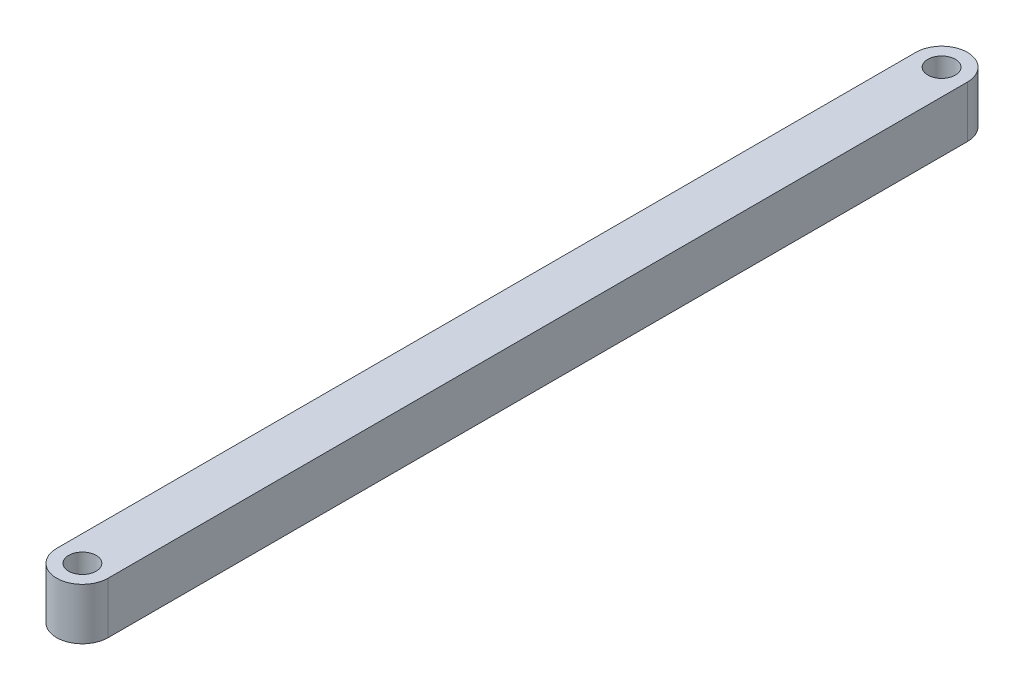
ISO-10303-21;
HEADER;
FILE_DESCRIPTION(('STEP AP214'),'2;1');
FILE_NAME('part.step','',(''),(''),'','','');
FILE_SCHEMA(('AUTOMOTIVE_DESIGN { 1 0 10303 214 1 1 1 1 }'));
ENDSEC;
DATA;
#1=APPLICATION_CONTEXT('core data for automotive mechanical design processes');
#2=APPLICATION_PROTOCOL_DEFINITION('international standard','automotive_design',2000,#1);
#3=PRODUCT_CONTEXT('',#1,'mechanical');
#4=PRODUCT('Part','Part','',(#3));
#5=PRODUCT_RELATED_PRODUCT_CATEGORY('part','',(#4));
#6=PRODUCT_DEFINITION_FORMATION('','',#4);
#7=PRODUCT_DEFINITION_CONTEXT('part definition',#1,'design');
#8=PRODUCT_DEFINITION('design','',#6,#7);
#9=PRODUCT_DEFINITION_SHAPE('','',#8);
#10=(LENGTH_UNIT() NAMED_UNIT(*) SI_UNIT(.MILLI.,.METRE.));
#11=(NAMED_UNIT(*) PLANE_ANGLE_UNIT() SI_UNIT($,.RADIAN.));
#12=(NAMED_UNIT(*) SI_UNIT($,.STERADIAN.) SOLID_ANGLE_UNIT());
#13=UNCERTAINTY_MEASURE_WITH_UNIT(LENGTH_MEASURE(1.E-05),#10,'distance_accuracy_value','');
#14=(GEOMETRIC_REPRESENTATION_CONTEXT(3) GLOBAL_UNCERTAINTY_ASSIGNED_CONTEXT((#13)) GLOBAL_UNIT_ASSIGNED_CONTEXT((#10,
#11,#12)) REPRESENTATION_CONTEXT('',''));
#15=CARTESIAN_POINT('',(0.,0.,0.));
#16=DIRECTION('',(0.,0.,1.));
#17=DIRECTION('',(1.,0.,0.));
#18=AXIS2_PLACEMENT_3D('',#15,#16,#17);
#19=CARTESIAN_POINT('',(0.,6.,50.));
#20=DIRECTION('',(0.,1.,0.));
#21=DIRECTION('',(0.,0.,1.));
#22=AXIS2_PLACEMENT_3D('',#19,#20,#21);
#23=PLANE('',#22);
#24=CARTESIAN_POINT('',(0.,6.,-50.));
#25=DIRECTION('',(0.,1.,0.));
#26=DIRECTION('',(0.,0.,1.));
#27=AXIS2_PLACEMENT_3D('',#24,#25,#26);
#28=CIRCLE('',#27,1.6);
#29=CARTESIAN_POINT('',(0.,6.,-48.4));
#30=VERTEX_POINT('',#29);
#31=EDGE_CURVE('E104',#30,#30,#28,.T.);
#32=ORIENTED_EDGE('',*,*,#31,.F.);
#33=EDGE_LOOP('',(#32));
#34=FACE_BOUND('',#33,.T.);
#35=CARTESIAN_POINT('',(0.,6.,50.));
#36=DIRECTION('',(0.,1.,0.));
#37=DIRECTION('',(0.,0.,1.));
#38=AXIS2_PLACEMENT_3D('',#35,#36,#37);
#39=CIRCLE('',#38,3.);
#40=CARTESIAN_POINT('',(-3.,6.,50.));
#41=VERTEX_POINT('',#40);
#42=CARTESIAN_POINT('',(3.,6.,50.));
#43=VERTEX_POINT('',#42);
#44=EDGE_CURVE('E89',#41,#43,#39,.T.);
#45=ORIENTED_EDGE('',*,*,#44,.T.);
#46=DIRECTION('',(0.,0.,-1.));
#47=VECTOR('',#46,1.);
#48=CARTESIAN_POINT('',(3.,6.,50.));
#49=LINE('',#48,#47);
#50=CARTESIAN_POINT('',(2.99999999999998,6.,-50.));
#51=VERTEX_POINT('',#50);
#52=EDGE_CURVE('E84',#43,#51,#49,.T.);
#53=ORIENTED_EDGE('',*,*,#52,.T.);
#54=CARTESIAN_POINT('',(0.,6.,-50.));
#55=DIRECTION('',(0.,1.,0.));
#56=DIRECTION('',(0.,0.,1.));
#57=AXIS2_PLACEMENT_3D('',#54,#55,#56);
#58=CIRCLE('',#57,3.);
#59=CARTESIAN_POINT('',(-3.00000000000002,6.,-50.));
#60=VERTEX_POINT('',#59);
#61=EDGE_CURVE('E87',#51,#60,#58,.T.);
#62=ORIENTED_EDGE('',*,*,#61,.T.);
#63=DIRECTION('',(0.,0.,1.));
#64=VECTOR('',#63,1.);
#65=CARTESIAN_POINT('',(-3.,6.,50.));
#66=LINE('',#65,#64);
#67=EDGE_CURVE('E54',#60,#41,#66,.T.);
#68=ORIENTED_EDGE('',*,*,#67,.T.);
#69=EDGE_LOOP('',(#45,#53,#62,#68));
#70=FACE_BOUND('',#69,.T.);
#71=CARTESIAN_POINT('',(0.,6.,50.));
#72=DIRECTION('',(0.,1.,0.));
#73=DIRECTION('',(0.,0.,1.));
#74=AXIS2_PLACEMENT_3D('',#71,#72,#73);
#75=CIRCLE('',#74,1.6);
#76=CARTESIAN_POINT('',(0.,6.,51.6));
#77=VERTEX_POINT('',#76);
#78=EDGE_CURVE('E119',#77,#77,#75,.T.);
#79=ORIENTED_EDGE('',*,*,#78,.F.);
#80=EDGE_LOOP('',(#79));
#81=FACE_BOUND('',#80,.T.);
#82=ADVANCED_FACE('F37',(#34,#70,#81),#23,.T.);
#83=CARTESIAN_POINT('',(0.,0.,50.));
#84=DIRECTION('',(0.,1.,0.));
#85=DIRECTION('',(0.,0.,1.));
#86=AXIS2_PLACEMENT_3D('',#83,#84,#85);
#87=PLANE('',#86);
#88=CARTESIAN_POINT('',(0.,0.,50.));
#89=DIRECTION('',(0.,1.,0.));
#90=DIRECTION('',(0.,0.,1.));
#91=AXIS2_PLACEMENT_3D('',#88,#89,#90);
#92=CIRCLE('',#91,3.);
#93=CARTESIAN_POINT('',(-3.,0.,50.));
#94=VERTEX_POINT('',#93);
#95=CARTESIAN_POINT('',(3.,0.,50.));
#96=VERTEX_POINT('',#95);
#97=EDGE_CURVE('E101',#94,#96,#92,.T.);
#98=ORIENTED_EDGE('',*,*,#97,.F.);
#99=DIRECTION('',(0.,0.,1.));
#100=VECTOR('',#99,1.);
#101=CARTESIAN_POINT('',(-3.,0.,50.));
#102=LINE('',#101,#100);
#103=CARTESIAN_POINT('',(-3.00000000000002,0.,-50.));
#104=VERTEX_POINT('',#103);
#105=EDGE_CURVE('E77',#104,#94,#102,.T.);
#106=ORIENTED_EDGE('',*,*,#105,.F.);
#107=CARTESIAN_POINT('',(0.,0.,-50.));
#108=DIRECTION('',(0.,1.,0.));
#109=DIRECTION('',(0.,0.,1.));
#110=AXIS2_PLACEMENT_3D('',#107,#108,#109);
#111=CIRCLE('',#110,3.);
#112=CARTESIAN_POINT('',(2.99999999999998,0.,-50.));
#113=VERTEX_POINT('',#112);
#114=EDGE_CURVE('E71',#113,#104,#111,.T.);
#115=ORIENTED_EDGE('',*,*,#114,.F.);
#116=DIRECTION('',(0.,0.,-1.));
#117=VECTOR('',#116,1.);
#118=CARTESIAN_POINT('',(3.,0.,50.));
#119=LINE('',#118,#117);
#120=EDGE_CURVE('E93',#96,#113,#119,.T.);
#121=ORIENTED_EDGE('',*,*,#120,.F.);
#122=EDGE_LOOP('',(#98,#106,#115,#121));
#123=FACE_BOUND('',#122,.T.);
#124=CARTESIAN_POINT('',(0.,0.,-50.));
#125=DIRECTION('',(0.,1.,0.));
#126=DIRECTION('',(0.,0.,1.));
#127=AXIS2_PLACEMENT_3D('',#124,#125,#126);
#128=CIRCLE('',#127,1.6);
#129=CARTESIAN_POINT('',(0.,0.,-48.4));
#130=VERTEX_POINT('',#129);
#131=EDGE_CURVE('E116',#130,#130,#128,.T.);
#132=ORIENTED_EDGE('',*,*,#131,.T.);
#133=EDGE_LOOP('',(#132));
#134=FACE_BOUND('',#133,.T.);
#135=CARTESIAN_POINT('',(0.,0.,50.));
#136=DIRECTION('',(0.,1.,0.));
#137=DIRECTION('',(0.,0.,1.));
#138=AXIS2_PLACEMENT_3D('',#135,#136,#137);
#139=CIRCLE('',#138,1.6);
#140=CARTESIAN_POINT('',(0.,0.,51.6));
#141=VERTEX_POINT('',#140);
#142=EDGE_CURVE('E122',#141,#141,#139,.T.);
#143=ORIENTED_EDGE('',*,*,#142,.T.);
#144=EDGE_LOOP('',(#143));
#145=FACE_BOUND('',#144,.T.);
#146=ADVANCED_FACE('F112',(#123,#134,#145),#87,.F.);
#147=CARTESIAN_POINT('',(0.,6.,50.));
#148=DIRECTION('',(0.,-1.,0.));
#149=DIRECTION('',(0.,0.,-1.));
#150=AXIS2_PLACEMENT_3D('',#147,#148,#149);
#151=CYLINDRICAL_SURFACE('',#150,3.);
#152=ORIENTED_EDGE('',*,*,#97,.T.);
#153=DIRECTION('',(0.,-1.,0.));
#154=VECTOR('',#153,1.);
#155=CARTESIAN_POINT('',(3.,6.,50.));
#156=LINE('',#155,#154);
#157=EDGE_CURVE('E11',#43,#96,#156,.T.);
#158=ORIENTED_EDGE('',*,*,#157,.F.);
#159=ORIENTED_EDGE('',*,*,#44,.F.);
#160=DIRECTION('',(0.,-1.,0.));
#161=VECTOR('',#160,1.);
#162=CARTESIAN_POINT('',(-3.,6.,50.));
#163=LINE('',#162,#161);
#164=EDGE_CURVE('E97',#41,#94,#163,.T.);
#165=ORIENTED_EDGE('',*,*,#164,.T.);
#166=EDGE_LOOP('',(#152,#158,#159,#165));
#167=FACE_BOUND('',#166,.T.);
#168=ADVANCED_FACE('F39',(#167),#151,.T.);
#169=CARTESIAN_POINT('',(3.,6.,50.));
#170=DIRECTION('',(-1.,0.,0.));
#171=DIRECTION('',(0.,0.,1.));
#172=AXIS2_PLACEMENT_3D('',#169,#170,#171);
#173=PLANE('',#172);
#174=ORIENTED_EDGE('',*,*,#120,.T.);
#175=DIRECTION('',(0.,-1.,0.));
#176=VECTOR('',#175,1.);
#177=CARTESIAN_POINT('',(2.99999999999998,6.,-50.));
#178=LINE('',#177,#176);
#179=EDGE_CURVE('E46',#51,#113,#178,.T.);
#180=ORIENTED_EDGE('',*,*,#179,.F.);
#181=ORIENTED_EDGE('',*,*,#52,.F.);
#182=ORIENTED_EDGE('',*,*,#157,.T.);
#183=EDGE_LOOP('',(#174,#180,#181,#182));
#184=FACE_BOUND('',#183,.T.);
#185=ADVANCED_FACE('F92',(#184),#173,.F.);
#186=CARTESIAN_POINT('',(0.,6.,-50.));
#187=DIRECTION('',(0.,-1.,0.));
#188=DIRECTION('',(0.,0.,-1.));
#189=AXIS2_PLACEMENT_3D('',#186,#187,#188);
#190=CYLINDRICAL_SURFACE('',#189,3.);
#191=ORIENTED_EDGE('',*,*,#114,.T.);
#192=DIRECTION('',(0.,-1.,0.));
#193=VECTOR('',#192,1.);
#194=CARTESIAN_POINT('',(-3.00000000000002,6.,-50.));
#195=LINE('',#194,#193);
#196=EDGE_CURVE('E94',#60,#104,#195,.T.);
#197=ORIENTED_EDGE('',*,*,#196,.F.);
#198=ORIENTED_EDGE('',*,*,#61,.F.);
#199=ORIENTED_EDGE('',*,*,#179,.T.);
#200=EDGE_LOOP('',(#191,#197,#198,#199));
#201=FACE_BOUND('',#200,.T.);
#202=ADVANCED_FACE('F95',(#201),#190,.T.);
#203=CARTESIAN_POINT('',(-3.,6.,50.));
#204=DIRECTION('',(1.,0.,0.));
#205=DIRECTION('',(0.,0.,-1.));
#206=AXIS2_PLACEMENT_3D('',#203,#204,#205);
#207=PLANE('',#206);
#208=ORIENTED_EDGE('',*,*,#105,.T.);
#209=ORIENTED_EDGE('',*,*,#164,.F.);
#210=ORIENTED_EDGE('',*,*,#67,.F.);
#211=ORIENTED_EDGE('',*,*,#196,.T.);
#212=EDGE_LOOP('',(#208,#209,#210,#211));
#213=FACE_BOUND('',#212,.T.);
#214=ADVANCED_FACE('F109',(#213),#207,.F.);
#215=CARTESIAN_POINT('',(0.,6.,-50.));
#216=DIRECTION('',(0.,-1.,0.));
#217=DIRECTION('',(0.,0.,-1.));
#218=AXIS2_PLACEMENT_3D('',#215,#216,#217);
#219=CYLINDRICAL_SURFACE('',#218,1.6);
#220=ORIENTED_EDGE('',*,*,#31,.T.);
#221=EDGE_LOOP('',(#220));
#222=FACE_BOUND('',#221,.T.);
#223=ORIENTED_EDGE('',*,*,#131,.F.);
#224=EDGE_LOOP('',(#223));
#225=FACE_BOUND('',#224,.T.);
#226=ADVANCED_FACE('F139',(#222,#225),#219,.F.);
#227=CARTESIAN_POINT('',(0.,6.,50.));
#228=DIRECTION('',(0.,-1.,0.));
#229=DIRECTION('',(0.,0.,-1.));
#230=AXIS2_PLACEMENT_3D('',#227,#228,#229);
#231=CYLINDRICAL_SURFACE('',#230,1.6);
#232=ORIENTED_EDGE('',*,*,#78,.T.);
#233=EDGE_LOOP('',(#232));
#234=FACE_BOUND('',#233,.T.);
#235=ORIENTED_EDGE('',*,*,#142,.F.);
#236=EDGE_LOOP('',(#235));
#237=FACE_BOUND('',#236,.T.);
#238=ADVANCED_FACE('F128',(#234,#237),#231,.F.);
#239=CLOSED_SHELL('',(#82,#146,#168,#185,#202,#214,#226,#238));
#240=MANIFOLD_SOLID_BREP('B2',#239);
#241=ADVANCED_BREP_SHAPE_REPRESENTATION('',(#18,#240),#14);
#242=SHAPE_DEFINITION_REPRESENTATION(#9,#241);
ENDSEC;
END-ISO-10303-21;
